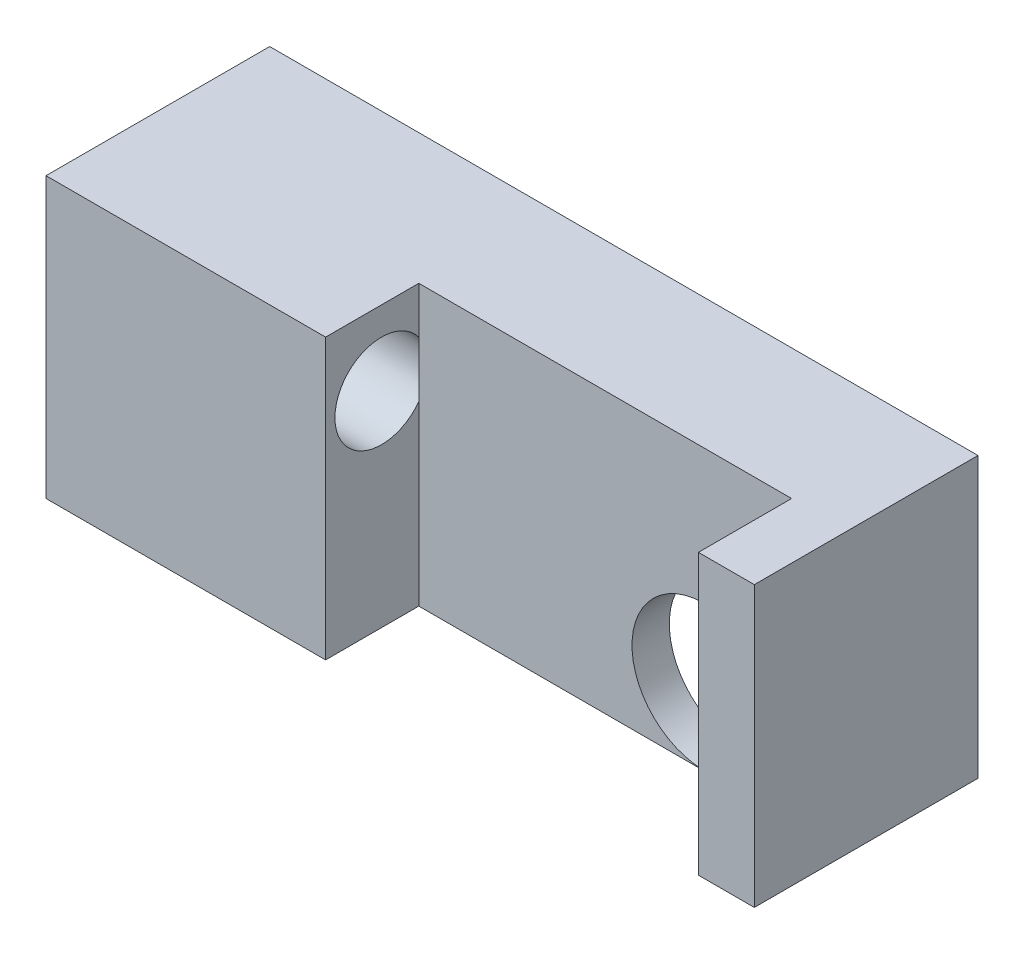
ISO-10303-21;
HEADER;
FILE_DESCRIPTION(('STEP AP214'),'2;1');
FILE_NAME('part.step','',(''),(''),'','','');
FILE_SCHEMA(('AUTOMOTIVE_DESIGN { 1 0 10303 214 1 1 1 1 }'));
ENDSEC;
DATA;
#1=APPLICATION_CONTEXT('core data for automotive mechanical design processes');
#2=APPLICATION_PROTOCOL_DEFINITION('international standard','automotive_design',2000,#1);
#3=PRODUCT_CONTEXT('',#1,'mechanical');
#4=PRODUCT('Part','Part','',(#3));
#5=PRODUCT_RELATED_PRODUCT_CATEGORY('part','',(#4));
#6=PRODUCT_DEFINITION_FORMATION('','',#4);
#7=PRODUCT_DEFINITION_CONTEXT('part definition',#1,'design');
#8=PRODUCT_DEFINITION('design','',#6,#7);
#9=PRODUCT_DEFINITION_SHAPE('','',#8);
#10=(LENGTH_UNIT() NAMED_UNIT(*) SI_UNIT(.MILLI.,.METRE.));
#11=(NAMED_UNIT(*) PLANE_ANGLE_UNIT() SI_UNIT($,.RADIAN.));
#12=(NAMED_UNIT(*) SI_UNIT($,.STERADIAN.) SOLID_ANGLE_UNIT());
#13=UNCERTAINTY_MEASURE_WITH_UNIT(LENGTH_MEASURE(1.E-05),#10,'distance_accuracy_value','');
#14=(GEOMETRIC_REPRESENTATION_CONTEXT(3) GLOBAL_UNCERTAINTY_ASSIGNED_CONTEXT((#13)) GLOBAL_UNIT_ASSIGNED_CONTEXT((#10,
#11,#12)) REPRESENTATION_CONTEXT('',''));
#15=CARTESIAN_POINT('',(0.,0.,0.));
#16=DIRECTION('',(0.,0.,1.));
#17=DIRECTION('',(1.,0.,0.));
#18=AXIS2_PLACEMENT_3D('',#15,#16,#17);
#19=CARTESIAN_POINT('',(0.,15.,0.));
#20=DIRECTION('',(0.,0.,-1.));
#21=DIRECTION('',(-1.,0.,0.));
#22=AXIS2_PLACEMENT_3D('',#19,#20,#21);
#23=PLANE('',#22);
#24=DIRECTION('',(1.,0.,0.));
#25=VECTOR('',#24,1.);
#26=CARTESIAN_POINT('',(0.,0.,0.));
#27=LINE('',#26,#25);
#28=CARTESIAN_POINT('',(0.,0.,0.));
#29=VERTEX_POINT('',#28);
#30=CARTESIAN_POINT('',(15.,0.,0.));
#31=VERTEX_POINT('',#30);
#32=EDGE_CURVE('E233',#29,#31,#27,.T.);
#33=ORIENTED_EDGE('',*,*,#32,.T.);
#34=DIRECTION('',(0.,-1.,0.));
#35=VECTOR('',#34,1.);
#36=CARTESIAN_POINT('',(15.,15.,0.));
#37=LINE('',#36,#35);
#38=CARTESIAN_POINT('',(15.,15.,0.));
#39=VERTEX_POINT('',#38);
#40=EDGE_CURVE('E200',#39,#31,#37,.T.);
#41=ORIENTED_EDGE('',*,*,#40,.F.);
#42=DIRECTION('',(1.,0.,0.));
#43=VECTOR('',#42,1.);
#44=CARTESIAN_POINT('',(0.,15.,0.));
#45=LINE('',#44,#43);
#46=CARTESIAN_POINT('',(0.,15.,0.));
#47=VERTEX_POINT('',#46);
#48=EDGE_CURVE('E222',#47,#39,#45,.T.);
#49=ORIENTED_EDGE('',*,*,#48,.F.);
#50=DIRECTION('',(0.,-1.,0.));
#51=VECTOR('',#50,1.);
#52=CARTESIAN_POINT('',(0.,15.,0.));
#53=LINE('',#52,#51);
#54=EDGE_CURVE('E11',#47,#29,#53,.T.);
#55=ORIENTED_EDGE('',*,*,#54,.T.);
#56=EDGE_LOOP('',(#33,#41,#49,#55));
#57=FACE_BOUND('',#56,.T.);
#58=ADVANCED_FACE('F33',(#57),#23,.F.);
#59=CARTESIAN_POINT('',(0.,15.,0.));
#60=DIRECTION('',(1.,0.,0.));
#61=DIRECTION('',(0.,0.,-1.));
#62=AXIS2_PLACEMENT_3D('',#59,#60,#61);
#63=PLANE('',#62);
#64=CARTESIAN_POINT('',(0.,11.,-3.));
#65=DIRECTION('',(-1.,0.,0.));
#66=DIRECTION('',(0.,0.,1.));
#67=AXIS2_PLACEMENT_3D('',#64,#65,#66);
#68=CIRCLE('',#67,1.15);
#69=CARTESIAN_POINT('',(0.,11.,-1.85));
#70=VERTEX_POINT('',#69);
#71=EDGE_CURVE('E206',#70,#70,#68,.T.);
#72=ORIENTED_EDGE('',*,*,#71,.F.);
#73=EDGE_LOOP('',(#72));
#74=FACE_BOUND('',#73,.T.);
#75=DIRECTION('',(0.,0.,1.));
#76=VECTOR('',#75,1.);
#77=CARTESIAN_POINT('',(0.,0.,0.));
#78=LINE('',#77,#76);
#79=CARTESIAN_POINT('',(0.,0.,-12.));
#80=VERTEX_POINT('',#79);
#81=EDGE_CURVE('E216',#80,#29,#78,.T.);
#82=ORIENTED_EDGE('',*,*,#81,.T.);
#83=ORIENTED_EDGE('',*,*,#54,.F.);
#84=DIRECTION('',(0.,0.,1.));
#85=VECTOR('',#84,1.);
#86=CARTESIAN_POINT('',(0.,15.,0.));
#87=LINE('',#86,#85);
#88=CARTESIAN_POINT('',(0.,15.,-12.));
#89=VERTEX_POINT('',#88);
#90=EDGE_CURVE('E217',#89,#47,#87,.T.);
#91=ORIENTED_EDGE('',*,*,#90,.F.);
#92=DIRECTION('',(0.,-1.,0.));
#93=VECTOR('',#92,1.);
#94=CARTESIAN_POINT('',(0.,15.,-12.));
#95=LINE('',#94,#93);
#96=EDGE_CURVE('E229',#89,#80,#95,.T.);
#97=ORIENTED_EDGE('',*,*,#96,.T.);
#98=EDGE_LOOP('',(#82,#83,#91,#97));
#99=FACE_BOUND('',#98,.T.);
#100=ADVANCED_FACE('F35',(#74,#99),#63,.F.);
#101=CARTESIAN_POINT('',(35.,15.,0.));
#102=VERTEX_POINT('',#101);
#103=CARTESIAN_POINT('',(38.,15.,0.));
#104=VERTEX_POINT('',#103);
#105=EDGE_CURVE('E220',#102,#104,#45,.T.);
#106=ORIENTED_EDGE('',*,*,#105,.F.);
#107=DIRECTION('',(0.,1.,0.));
#108=VECTOR('',#107,1.);
#109=CARTESIAN_POINT('',(35.,15.,0.));
#110=LINE('',#109,#108);
#111=CARTESIAN_POINT('',(35.,0.,0.));
#112=VERTEX_POINT('',#111);
#113=EDGE_CURVE('E202',#112,#102,#110,.T.);
#114=ORIENTED_EDGE('',*,*,#113,.F.);
#115=CARTESIAN_POINT('',(38.,0.,0.));
#116=VERTEX_POINT('',#115);
#117=EDGE_CURVE('E232',#112,#116,#27,.T.);
#118=ORIENTED_EDGE('',*,*,#117,.T.);
#119=DIRECTION('',(0.,-1.,0.));
#120=VECTOR('',#119,1.);
#121=CARTESIAN_POINT('',(38.,15.,0.));
#122=LINE('',#121,#120);
#123=EDGE_CURVE('E42',#104,#116,#122,.T.);
#124=ORIENTED_EDGE('',*,*,#123,.F.);
#125=EDGE_LOOP('',(#106,#114,#118,#124));
#126=FACE_BOUND('',#125,.T.);
#127=ADVANCED_FACE('F271',(#126),#23,.F.);
#128=CARTESIAN_POINT('',(38.,15.,0.));
#129=DIRECTION('',(-1.,0.,0.));
#130=DIRECTION('',(0.,0.,1.));
#131=AXIS2_PLACEMENT_3D('',#128,#129,#130);
#132=PLANE('',#131);
#133=DIRECTION('',(0.,0.,-1.));
#134=VECTOR('',#133,1.);
#135=CARTESIAN_POINT('',(38.,0.,0.));
#136=LINE('',#135,#134);
#137=CARTESIAN_POINT('',(38.,0.,-12.));
#138=VERTEX_POINT('',#137);
#139=EDGE_CURVE('E236',#116,#138,#136,.T.);
#140=ORIENTED_EDGE('',*,*,#139,.T.);
#141=DIRECTION('',(0.,-1.,0.));
#142=VECTOR('',#141,1.);
#143=CARTESIAN_POINT('',(38.,15.,-12.));
#144=LINE('',#143,#142);
#145=CARTESIAN_POINT('',(38.,15.,-12.));
#146=VERTEX_POINT('',#145);
#147=EDGE_CURVE('E243',#146,#138,#144,.T.);
#148=ORIENTED_EDGE('',*,*,#147,.F.);
#149=DIRECTION('',(0.,0.,-1.));
#150=VECTOR('',#149,1.);
#151=CARTESIAN_POINT('',(38.,15.,0.));
#152=LINE('',#151,#150);
#153=EDGE_CURVE('E225',#104,#146,#152,.T.);
#154=ORIENTED_EDGE('',*,*,#153,.F.);
#155=ORIENTED_EDGE('',*,*,#123,.T.);
#156=EDGE_LOOP('',(#140,#148,#154,#155));
#157=FACE_BOUND('',#156,.T.);
#158=ADVANCED_FACE('F251',(#157),#132,.F.);
#159=CARTESIAN_POINT('',(0.,15.,-12.));
#160=DIRECTION('',(0.,0.,1.));
#161=DIRECTION('',(1.,0.,0.));
#162=AXIS2_PLACEMENT_3D('',#159,#160,#161);
#163=PLANE('',#162);
#164=DIRECTION('',(-1.,0.,0.));
#165=VECTOR('',#164,1.);
#166=CARTESIAN_POINT('',(0.,0.,-12.));
#167=LINE('',#166,#165);
#168=CARTESIAN_POINT('',(33.2425897256563,0.,-12.));
#169=VERTEX_POINT('',#168);
#170=EDGE_CURVE('E221',#138,#169,#167,.T.);
#171=ORIENTED_EDGE('',*,*,#170,.T.);
#172=DIRECTION('',(0.,-1.,0.));
#173=VECTOR('',#172,1.);
#174=CARTESIAN_POINT('',(33.2425897256563,0.,-12.));
#175=LINE('',#174,#173);
#176=CARTESIAN_POINT('',(33.2425897256563,8.60446008226745,-12.));
#177=VERTEX_POINT('',#176);
#178=EDGE_CURVE('E144',#177,#169,#175,.T.);
#179=ORIENTED_EDGE('',*,*,#178,.F.);
#180=DIRECTION('',(1.,0.,0.));
#181=VECTOR('',#180,1.);
#182=CARTESIAN_POINT('',(33.2425897256563,8.60446008226745,-12.));
#183=LINE('',#182,#181);
#184=CARTESIAN_POINT('',(9.75747309413322,8.60446008226745,-12.));
#185=VERTEX_POINT('',#184);
#186=EDGE_CURVE('E158',#185,#177,#183,.T.);
#187=ORIENTED_EDGE('',*,*,#186,.F.);
#188=DIRECTION('',(0.,1.,0.));
#189=VECTOR('',#188,1.);
#190=CARTESIAN_POINT('',(9.75747309413322,0.,-12.));
#191=LINE('',#190,#189);
#192=CARTESIAN_POINT('',(9.75747309413322,0.,-12.));
#193=VERTEX_POINT('',#192);
#194=EDGE_CURVE('E160',#193,#185,#191,.T.);
#195=ORIENTED_EDGE('',*,*,#194,.F.);
#196=EDGE_CURVE('E238',#193,#80,#167,.T.);
#197=ORIENTED_EDGE('',*,*,#196,.T.);
#198=ORIENTED_EDGE('',*,*,#96,.F.);
#199=DIRECTION('',(-1.,0.,0.));
#200=VECTOR('',#199,1.);
#201=CARTESIAN_POINT('',(0.,15.,-12.));
#202=LINE('',#201,#200);
#203=EDGE_CURVE('E227',#146,#89,#202,.T.);
#204=ORIENTED_EDGE('',*,*,#203,.F.);
#205=ORIENTED_EDGE('',*,*,#147,.T.);
#206=EDGE_LOOP('',(#171,#179,#187,#195,#197,#198,#204,#205));
#207=FACE_BOUND('',#206,.T.);
#208=ADVANCED_FACE('F262',(#207),#163,.F.);
#209=CARTESIAN_POINT('',(0.,15.,0.));
#210=DIRECTION('',(0.,-1.,0.));
#211=DIRECTION('',(0.,0.,-1.));
#212=AXIS2_PLACEMENT_3D('',#209,#210,#211);
#213=PLANE('',#212);
#214=ORIENTED_EDGE('',*,*,#48,.T.);
#215=DIRECTION('',(0.,0.,1.));
#216=VECTOR('',#215,1.);
#217=CARTESIAN_POINT('',(15.,15.,-5.));
#218=LINE('',#217,#216);
#219=CARTESIAN_POINT('',(15.,15.,-5.));
#220=VERTEX_POINT('',#219);
#221=EDGE_CURVE('E204',#220,#39,#218,.T.);
#222=ORIENTED_EDGE('',*,*,#221,.F.);
#223=DIRECTION('',(-1.,0.,0.));
#224=VECTOR('',#223,1.);
#225=CARTESIAN_POINT('',(15.,15.,-5.));
#226=LINE('',#225,#224);
#227=CARTESIAN_POINT('',(35.,15.,-5.));
#228=VERTEX_POINT('',#227);
#229=EDGE_CURVE('E196',#228,#220,#226,.T.);
#230=ORIENTED_EDGE('',*,*,#229,.F.);
#231=DIRECTION('',(0.,0.,1.));
#232=VECTOR('',#231,1.);
#233=CARTESIAN_POINT('',(35.,15.,-5.));
#234=LINE('',#233,#232);
#235=EDGE_CURVE('E207',#228,#102,#234,.T.);
#236=ORIENTED_EDGE('',*,*,#235,.T.);
#237=ORIENTED_EDGE('',*,*,#105,.T.);
#238=ORIENTED_EDGE('',*,*,#153,.T.);
#239=ORIENTED_EDGE('',*,*,#203,.T.);
#240=ORIENTED_EDGE('',*,*,#90,.T.);
#241=EDGE_LOOP('',(#214,#222,#230,#236,#237,#238,#239,#240));
#242=FACE_BOUND('',#241,.T.);
#243=ADVANCED_FACE('F267',(#242),#213,.F.);
#244=CARTESIAN_POINT('',(0.,0.,0.));
#245=DIRECTION('',(0.,-1.,0.));
#246=DIRECTION('',(0.,0.,-1.));
#247=AXIS2_PLACEMENT_3D('',#244,#245,#246);
#248=PLANE('',#247);
#249=DIRECTION('',(0.,0.,-1.));
#250=VECTOR('',#249,1.);
#251=CARTESIAN_POINT('',(33.2425897256563,0.,-7.));
#252=LINE('',#251,#250);
#253=CARTESIAN_POINT('',(33.2425897256563,0.,-7.));
#254=VERTEX_POINT('',#253);
#255=EDGE_CURVE('E176',#254,#169,#252,.T.);
#256=ORIENTED_EDGE('',*,*,#255,.T.);
#257=ORIENTED_EDGE('',*,*,#170,.F.);
#258=ORIENTED_EDGE('',*,*,#139,.F.);
#259=ORIENTED_EDGE('',*,*,#117,.F.);
#260=DIRECTION('',(0.,0.,1.));
#261=VECTOR('',#260,1.);
#262=CARTESIAN_POINT('',(35.,0.,-5.));
#263=LINE('',#262,#261);
#264=CARTESIAN_POINT('',(35.,0.,-5.));
#265=VERTEX_POINT('',#264);
#266=EDGE_CURVE('E210',#265,#112,#263,.T.);
#267=ORIENTED_EDGE('',*,*,#266,.F.);
#268=DIRECTION('',(1.,0.,0.));
#269=VECTOR('',#268,1.);
#270=CARTESIAN_POINT('',(15.,0.,-5.));
#271=LINE('',#270,#269);
#272=CARTESIAN_POINT('',(15.,0.,-5.));
#273=VERTEX_POINT('',#272);
#274=EDGE_CURVE('E188',#273,#265,#271,.T.);
#275=ORIENTED_EDGE('',*,*,#274,.F.);
#276=DIRECTION('',(0.,0.,1.));
#277=VECTOR('',#276,1.);
#278=CARTESIAN_POINT('',(15.,0.,-5.));
#279=LINE('',#278,#277);
#280=EDGE_CURVE('E199',#273,#31,#279,.T.);
#281=ORIENTED_EDGE('',*,*,#280,.T.);
#282=ORIENTED_EDGE('',*,*,#32,.F.);
#283=ORIENTED_EDGE('',*,*,#81,.F.);
#284=ORIENTED_EDGE('',*,*,#196,.F.);
#285=DIRECTION('',(0.,0.,-1.));
#286=VECTOR('',#285,1.);
#287=CARTESIAN_POINT('',(9.75747309413322,0.,-7.));
#288=LINE('',#287,#286);
#289=CARTESIAN_POINT('',(9.75747309413322,0.,-7.));
#290=VERTEX_POINT('',#289);
#291=EDGE_CURVE('E174',#290,#193,#288,.T.);
#292=ORIENTED_EDGE('',*,*,#291,.F.);
#293=DIRECTION('',(-1.,0.,0.));
#294=VECTOR('',#293,1.);
#295=CARTESIAN_POINT('',(33.2425897256563,0.,-7.));
#296=LINE('',#295,#294);
#297=EDGE_CURVE('E155',#254,#290,#296,.T.);
#298=ORIENTED_EDGE('',*,*,#297,.F.);
#299=EDGE_LOOP('',(#256,#257,#258,#259,#267,#275,#281,#282,#283,#284,#292,#298));
#300=FACE_BOUND('',#299,.T.);
#301=ADVANCED_FACE('F258',(#300),#248,.T.);
#302=CARTESIAN_POINT('',(15.,11.,-3.));
#303=DIRECTION('',(-1.,0.,0.));
#304=DIRECTION('',(0.,0.,1.));
#305=AXIS2_PLACEMENT_3D('',#302,#303,#304);
#306=CYLINDRICAL_SURFACE('',#305,1.15);
#307=CARTESIAN_POINT('',(6.,11.,-3.));
#308=DIRECTION('',(-1.,0.,0.));
#309=DIRECTION('',(0.,0.,1.));
#310=AXIS2_PLACEMENT_3D('',#307,#308,#309);
#311=CIRCLE('',#310,1.15);
#312=CARTESIAN_POINT('',(6.,11.,-1.85));
#313=VERTEX_POINT('',#312);
#314=EDGE_CURVE('E37',#313,#313,#311,.F.);
#315=ORIENTED_EDGE('',*,*,#314,.T.);
#316=EDGE_LOOP('',(#315));
#317=FACE_BOUND('',#316,.T.);
#318=ORIENTED_EDGE('',*,*,#71,.T.);
#319=EDGE_LOOP('',(#318));
#320=FACE_BOUND('',#319,.T.);
#321=ADVANCED_FACE('F320',(#317,#320),#306,.F.);
#322=CARTESIAN_POINT('',(15.,15.,-5.));
#323=DIRECTION('',(-1.,0.,0.));
#324=DIRECTION('',(0.,-1.,0.));
#325=AXIS2_PLACEMENT_3D('',#322,#323,#324);
#326=PLANE('',#325);
#327=DIRECTION('',(0.,-1.,0.));
#328=VECTOR('',#327,1.);
#329=CARTESIAN_POINT('',(15.,15.,-5.));
#330=LINE('',#329,#328);
#331=CARTESIAN_POINT('',(15.,9.5,-5.));
#332=VERTEX_POINT('',#331);
#333=EDGE_CURVE('E190',#332,#273,#330,.T.);
#334=ORIENTED_EDGE('',*,*,#333,.F.);
#335=CARTESIAN_POINT('',(15.,11.,-3.));
#336=DIRECTION('',(-1.,0.,0.));
#337=DIRECTION('',(0.,-1.,0.));
#338=AXIS2_PLACEMENT_3D('',#335,#336,#337);
#339=CIRCLE('',#338,2.5);
#340=CARTESIAN_POINT('',(15.,12.5,-5.));
#341=VERTEX_POINT('',#340);
#342=EDGE_CURVE('E181',#341,#332,#339,.F.);
#343=ORIENTED_EDGE('',*,*,#342,.F.);
#344=EDGE_CURVE('E185',#220,#341,#330,.T.);
#345=ORIENTED_EDGE('',*,*,#344,.F.);
#346=ORIENTED_EDGE('',*,*,#221,.T.);
#347=ORIENTED_EDGE('',*,*,#40,.T.);
#348=ORIENTED_EDGE('',*,*,#280,.F.);
#349=EDGE_LOOP('',(#334,#343,#345,#346,#347,#348));
#350=FACE_BOUND('',#349,.T.);
#351=ADVANCED_FACE('F282',(#350),#326,.F.);
#352=CARTESIAN_POINT('',(35.,15.,-5.));
#353=DIRECTION('',(1.,0.,0.));
#354=DIRECTION('',(0.,0.,-1.));
#355=AXIS2_PLACEMENT_3D('',#352,#353,#354);
#356=PLANE('',#355);
#357=ORIENTED_EDGE('',*,*,#113,.T.);
#358=ORIENTED_EDGE('',*,*,#235,.F.);
#359=DIRECTION('',(0.,1.,0.));
#360=VECTOR('',#359,1.);
#361=CARTESIAN_POINT('',(35.,15.,-5.));
#362=LINE('',#361,#360);
#363=EDGE_CURVE('E193',#265,#228,#362,.T.);
#364=ORIENTED_EDGE('',*,*,#363,.F.);
#365=ORIENTED_EDGE('',*,*,#266,.T.);
#366=EDGE_LOOP('',(#357,#358,#364,#365));
#367=FACE_BOUND('',#366,.T.);
#368=ADVANCED_FACE('F273',(#367),#356,.F.);
#369=CARTESIAN_POINT('',(0.,0.,-5.));
#370=DIRECTION('',(0.,0.,1.));
#371=DIRECTION('',(1.,0.,0.));
#372=AXIS2_PLACEMENT_3D('',#369,#370,#371);
#373=PLANE('',#372);
#374=CARTESIAN_POINT('',(30.325082156633,3.90421707908217,-5.));
#375=DIRECTION('',(0.,0.,1.));
#376=DIRECTION('',(1.,0.,0.));
#377=AXIS2_PLACEMENT_3D('',#374,#375,#376);
#378=CIRCLE('',#377,3.88666233442879);
#379=CARTESIAN_POINT('',(34.2117444910618,3.90421707908217,-5.));
#380=VERTEX_POINT('',#379);
#381=EDGE_CURVE('E139',#380,#380,#378,.T.);
#382=ORIENTED_EDGE('',*,*,#381,.F.);
#383=EDGE_LOOP('',(#382));
#384=FACE_BOUND('',#383,.T.);
#385=ORIENTED_EDGE('',*,*,#344,.T.);
#386=EDGE_CURVE('E189',#341,#332,#330,.T.);
#387=ORIENTED_EDGE('',*,*,#386,.T.);
#388=ORIENTED_EDGE('',*,*,#333,.T.);
#389=ORIENTED_EDGE('',*,*,#274,.T.);
#390=ORIENTED_EDGE('',*,*,#363,.T.);
#391=ORIENTED_EDGE('',*,*,#229,.T.);
#392=EDGE_LOOP('',(#385,#387,#388,#389,#390,#391));
#393=FACE_BOUND('',#392,.T.);
#394=ADVANCED_FACE('F277',(#384,#393),#373,.T.);
#395=CARTESIAN_POINT('',(6.,11.,-3.));
#396=DIRECTION('',(-1.,0.,0.));
#397=DIRECTION('',(0.,0.,1.));
#398=AXIS2_PLACEMENT_3D('',#395,#396,#397);
#399=PLANE('',#398);
#400=CARTESIAN_POINT('',(6.,11.,-3.));
#401=DIRECTION('',(-1.,0.,0.));
#402=DIRECTION('',(0.,0.,1.));
#403=AXIS2_PLACEMENT_3D('',#400,#401,#402);
#404=CIRCLE('',#403,2.5);
#405=CARTESIAN_POINT('',(6.,11.,-0.5));
#406=VERTEX_POINT('',#405);
#407=EDGE_CURVE('E171',#406,#406,#404,.T.);
#408=ORIENTED_EDGE('',*,*,#407,.F.);
#409=EDGE_LOOP('',(#408));
#410=FACE_BOUND('',#409,.T.);
#411=ORIENTED_EDGE('',*,*,#314,.F.);
#412=EDGE_LOOP('',(#411));
#413=FACE_BOUND('',#412,.T.);
#414=ADVANCED_FACE('F300',(#410,#413),#399,.F.);
#415=CARTESIAN_POINT('',(22.0710678118655,11.,-3.));
#416=DIRECTION('',(-1.,0.,0.));
#417=DIRECTION('',(0.,0.,1.));
#418=AXIS2_PLACEMENT_3D('',#415,#416,#417);
#419=CYLINDRICAL_SURFACE('',#418,2.5);
#420=EDGE_CURVE('E182',#332,#341,#339,.F.);
#421=ORIENTED_EDGE('',*,*,#420,.T.);
#422=ORIENTED_EDGE('',*,*,#342,.T.);
#423=EDGE_LOOP('',(#421,#422));
#424=FACE_BOUND('',#423,.T.);
#425=ORIENTED_EDGE('',*,*,#407,.T.);
#426=EDGE_LOOP('',(#425));
#427=FACE_BOUND('',#426,.T.);
#428=ADVANCED_FACE('F288',(#424,#427),#419,.F.);
#429=CARTESIAN_POINT('',(15.,15.,-5.));
#430=DIRECTION('',(-1.,0.,0.));
#431=DIRECTION('',(0.,-1.,0.));
#432=AXIS2_PLACEMENT_3D('',#429,#430,#431);
#433=PLANE('',#432);
#434=ORIENTED_EDGE('',*,*,#420,.F.);
#435=ORIENTED_EDGE('',*,*,#386,.F.);
#436=EDGE_LOOP('',(#434,#435));
#437=FACE_BOUND('',#436,.T.);
#438=ADVANCED_FACE('F291',(#437),#433,.T.);
#439=CARTESIAN_POINT('',(33.2425897256563,0.,-7.));
#440=DIRECTION('',(1.,0.,0.));
#441=DIRECTION('',(0.,0.,-1.));
#442=AXIS2_PLACEMENT_3D('',#439,#440,#441);
#443=PLANE('',#442);
#444=ORIENTED_EDGE('',*,*,#178,.T.);
#445=ORIENTED_EDGE('',*,*,#255,.F.);
#446=DIRECTION('',(0.,-1.,0.));
#447=VECTOR('',#446,1.);
#448=CARTESIAN_POINT('',(33.2425897256563,0.,-7.));
#449=LINE('',#448,#447);
#450=CARTESIAN_POINT('',(33.2425897256563,1.33628139325218,-7.));
#451=VERTEX_POINT('',#450);
#452=EDGE_CURVE('E56',#451,#254,#449,.T.);
#453=ORIENTED_EDGE('',*,*,#452,.F.);
#454=CARTESIAN_POINT('',(33.2425897256563,6.47215276491216,-7.));
#455=VERTEX_POINT('',#454);
#456=EDGE_CURVE('E137',#455,#451,#449,.T.);
#457=ORIENTED_EDGE('',*,*,#456,.F.);
#458=CARTESIAN_POINT('',(33.2425897256563,8.60446008226745,-7.));
#459=VERTEX_POINT('',#458);
#460=EDGE_CURVE('E148',#459,#455,#449,.T.);
#461=ORIENTED_EDGE('',*,*,#460,.F.);
#462=DIRECTION('',(0.,0.,-1.));
#463=VECTOR('',#462,1.);
#464=CARTESIAN_POINT('',(33.2425897256563,8.60446008226745,-7.));
#465=LINE('',#464,#463);
#466=EDGE_CURVE('E169',#459,#177,#465,.T.);
#467=ORIENTED_EDGE('',*,*,#466,.T.);
#468=EDGE_LOOP('',(#444,#445,#453,#457,#461,#467));
#469=FACE_BOUND('',#468,.T.);
#470=ADVANCED_FACE('F147',(#469),#443,.F.);
#471=CARTESIAN_POINT('',(33.2425897256563,8.60446008226745,-7.));
#472=DIRECTION('',(0.,1.,0.));
#473=DIRECTION('',(0.,0.,1.));
#474=AXIS2_PLACEMENT_3D('',#471,#472,#473);
#475=PLANE('',#474);
#476=ORIENTED_EDGE('',*,*,#186,.T.);
#477=ORIENTED_EDGE('',*,*,#466,.F.);
#478=DIRECTION('',(1.,0.,0.));
#479=VECTOR('',#478,1.);
#480=CARTESIAN_POINT('',(33.2425897256563,8.60446008226745,-7.));
#481=LINE('',#480,#479);
#482=CARTESIAN_POINT('',(9.75747309413322,8.60446008226745,-7.));
#483=VERTEX_POINT('',#482);
#484=EDGE_CURVE('E154',#483,#459,#481,.T.);
#485=ORIENTED_EDGE('',*,*,#484,.F.);
#486=DIRECTION('',(0.,0.,-1.));
#487=VECTOR('',#486,1.);
#488=CARTESIAN_POINT('',(9.75747309413322,8.60446008226745,-7.));
#489=LINE('',#488,#487);
#490=EDGE_CURVE('E172',#483,#185,#489,.T.);
#491=ORIENTED_EDGE('',*,*,#490,.T.);
#492=EDGE_LOOP('',(#476,#477,#485,#491));
#493=FACE_BOUND('',#492,.T.);
#494=ADVANCED_FACE('F298',(#493),#475,.F.);
#495=CARTESIAN_POINT('',(9.75747309413322,0.,-7.));
#496=DIRECTION('',(-1.,0.,0.));
#497=DIRECTION('',(0.,0.,1.));
#498=AXIS2_PLACEMENT_3D('',#495,#496,#497);
#499=PLANE('',#498);
#500=ORIENTED_EDGE('',*,*,#194,.T.);
#501=ORIENTED_EDGE('',*,*,#490,.F.);
#502=DIRECTION('',(0.,1.,0.));
#503=VECTOR('',#502,1.);
#504=CARTESIAN_POINT('',(9.75747309413322,0.,-7.));
#505=LINE('',#504,#503);
#506=EDGE_CURVE('E156',#290,#483,#505,.T.);
#507=ORIENTED_EDGE('',*,*,#506,.F.);
#508=ORIENTED_EDGE('',*,*,#291,.T.);
#509=EDGE_LOOP('',(#500,#501,#507,#508));
#510=FACE_BOUND('',#509,.T.);
#511=ADVANCED_FACE('F348',(#510),#499,.F.);
#512=CARTESIAN_POINT('',(0.,0.,-7.));
#513=DIRECTION('',(0.,0.,1.));
#514=DIRECTION('',(1.,0.,0.));
#515=AXIS2_PLACEMENT_3D('',#512,#513,#514);
#516=PLANE('',#515);
#517=ORIENTED_EDGE('',*,*,#460,.T.);
#518=CARTESIAN_POINT('',(30.325082156633,3.90421707908217,-7.));
#519=DIRECTION('',(0.,0.,1.));
#520=DIRECTION('',(1.,0.,0.));
#521=AXIS2_PLACEMENT_3D('',#518,#519,#520);
#522=CIRCLE('',#521,3.88666233442879);
#523=EDGE_CURVE('E138',#451,#455,#522,.F.);
#524=ORIENTED_EDGE('',*,*,#523,.F.);
#525=ORIENTED_EDGE('',*,*,#452,.T.);
#526=ORIENTED_EDGE('',*,*,#297,.T.);
#527=ORIENTED_EDGE('',*,*,#506,.T.);
#528=ORIENTED_EDGE('',*,*,#484,.T.);
#529=EDGE_LOOP('',(#517,#524,#525,#526,#527,#528));
#530=FACE_BOUND('',#529,.T.);
#531=ADVANCED_FACE('F151',(#530),#516,.F.);
#532=CARTESIAN_POINT('',(0.,0.,-7.));
#533=DIRECTION('',(0.,0.,1.));
#534=DIRECTION('',(1.,0.,0.));
#535=AXIS2_PLACEMENT_3D('',#532,#533,#534);
#536=PLANE('',#535);
#537=ORIENTED_EDGE('',*,*,#456,.T.);
#538=EDGE_CURVE('E48',#455,#451,#522,.F.);
#539=ORIENTED_EDGE('',*,*,#538,.F.);
#540=EDGE_LOOP('',(#537,#539));
#541=FACE_BOUND('',#540,.T.);
#542=ADVANCED_FACE('F135',(#541),#536,.T.);
#543=CARTESIAN_POINT('',(30.325082156633,3.90421707908217,-17.9931411714277));
#544=DIRECTION('',(0.,0.,1.));
#545=DIRECTION('',(1.,0.,0.));
#546=AXIS2_PLACEMENT_3D('',#543,#544,#545);
#547=CYLINDRICAL_SURFACE('',#546,3.88666233442879);
#548=ORIENTED_EDGE('',*,*,#523,.T.);
#549=ORIENTED_EDGE('',*,*,#538,.T.);
#550=EDGE_LOOP('',(#548,#549));
#551=FACE_BOUND('',#550,.T.);
#552=ORIENTED_EDGE('',*,*,#381,.T.);
#553=EDGE_LOOP('',(#552));
#554=FACE_BOUND('',#553,.T.);
#555=ADVANCED_FACE('F141',(#551,#554),#547,.F.);
#556=CLOSED_SHELL('',(#58,#100,#127,#158,#208,#243,#301,#321,#351,#368,#394,#414,#428,#438,#470,
#494,#511,#531,#542,#555));
#557=MANIFOLD_SOLID_BREP('B2',#556);
#558=ADVANCED_BREP_SHAPE_REPRESENTATION('',(#18,#557),#14);
#559=SHAPE_DEFINITION_REPRESENTATION(#9,#558);
ENDSEC;
END-ISO-10303-21;
